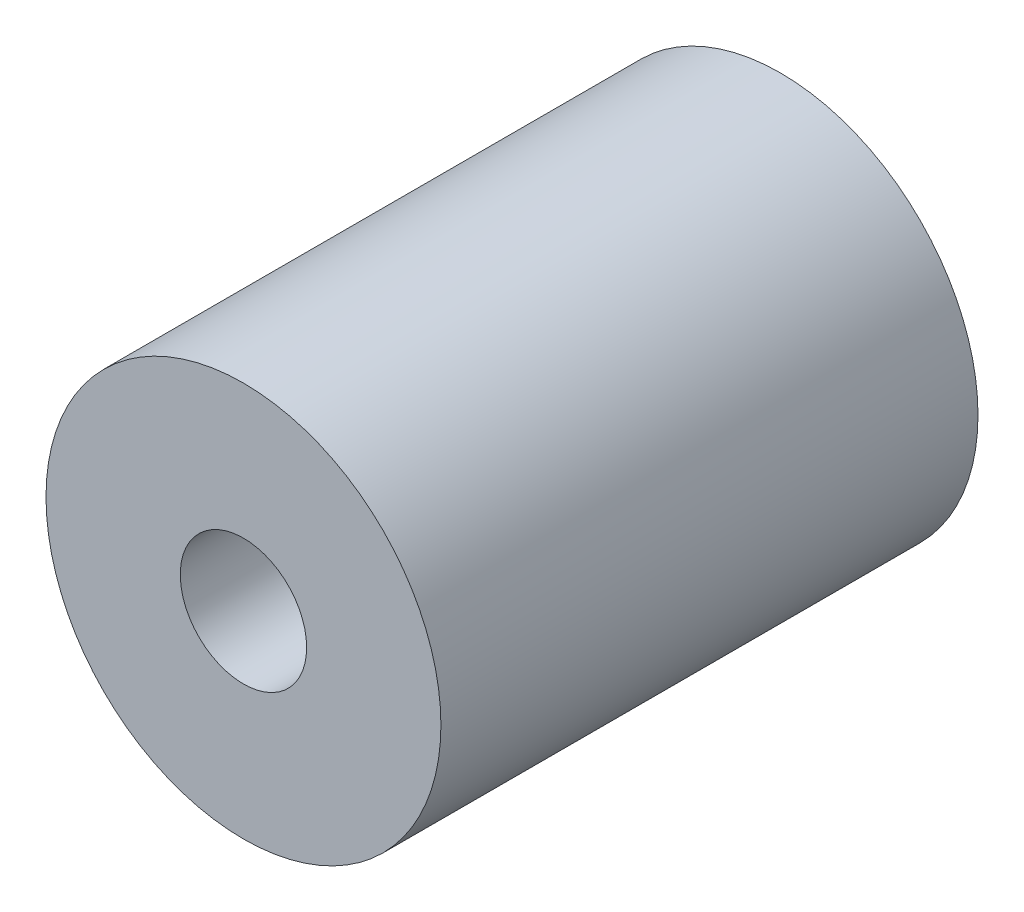
ISO-10303-21;
HEADER;
FILE_DESCRIPTION(('STEP AP214'),'2;1');
FILE_NAME('part.step','',(''),(''),'','','');
FILE_SCHEMA(('AUTOMOTIVE_DESIGN { 1 0 10303 214 1 1 1 1 }'));
ENDSEC;
DATA;
#1=APPLICATION_CONTEXT('core data for automotive mechanical design processes');
#2=APPLICATION_PROTOCOL_DEFINITION('international standard','automotive_design',2000,#1);
#3=PRODUCT_CONTEXT('',#1,'mechanical');
#4=PRODUCT('Part','Part','',(#3));
#5=PRODUCT_RELATED_PRODUCT_CATEGORY('part','',(#4));
#6=PRODUCT_DEFINITION_FORMATION('','',#4);
#7=PRODUCT_DEFINITION_CONTEXT('part definition',#1,'design');
#8=PRODUCT_DEFINITION('design','',#6,#7);
#9=PRODUCT_DEFINITION_SHAPE('','',#8);
#10=(LENGTH_UNIT() NAMED_UNIT(*) SI_UNIT(.MILLI.,.METRE.));
#11=(NAMED_UNIT(*) PLANE_ANGLE_UNIT() SI_UNIT($,.RADIAN.));
#12=(NAMED_UNIT(*) SI_UNIT($,.STERADIAN.) SOLID_ANGLE_UNIT());
#13=UNCERTAINTY_MEASURE_WITH_UNIT(LENGTH_MEASURE(1.E-05),#10,'distance_accuracy_value','');
#14=(GEOMETRIC_REPRESENTATION_CONTEXT(3) GLOBAL_UNCERTAINTY_ASSIGNED_CONTEXT((#13)) GLOBAL_UNIT_ASSIGNED_CONTEXT((#10,
#11,#12)) REPRESENTATION_CONTEXT('',''));
#15=CARTESIAN_POINT('',(0.,0.,0.));
#16=DIRECTION('',(0.,0.,1.));
#17=DIRECTION('',(1.,0.,0.));
#18=AXIS2_PLACEMENT_3D('',#15,#16,#17);
#19=CARTESIAN_POINT('',(0.,0.,34.));
#20=DIRECTION('',(0.,0.,-1.));
#21=DIRECTION('',(-1.,0.,0.));
#22=AXIS2_PLACEMENT_3D('',#19,#20,#21);
#23=CYLINDRICAL_SURFACE('',#22,12.5);
#24=CARTESIAN_POINT('',(0.,0.,34.));
#25=DIRECTION('',(0.,0.,1.));
#26=DIRECTION('',(1.,0.,0.));
#27=AXIS2_PLACEMENT_3D('',#24,#25,#26);
#28=CIRCLE('',#27,12.5);
#29=CARTESIAN_POINT('',(12.5,0.,34.));
#30=VERTEX_POINT('',#29);
#31=EDGE_CURVE('E10',#30,#30,#28,.T.);
#32=ORIENTED_EDGE('',*,*,#31,.F.);
#33=EDGE_LOOP('',(#32));
#34=FACE_BOUND('',#33,.T.);
#35=CARTESIAN_POINT('',(0.,0.,0.));
#36=DIRECTION('',(0.,0.,1.));
#37=DIRECTION('',(1.,0.,0.));
#38=AXIS2_PLACEMENT_3D('',#35,#36,#37);
#39=CIRCLE('',#38,12.5);
#40=CARTESIAN_POINT('',(12.5,0.,0.));
#41=VERTEX_POINT('',#40);
#42=EDGE_CURVE('E34',#41,#41,#39,.T.);
#43=ORIENTED_EDGE('',*,*,#42,.T.);
#44=EDGE_LOOP('',(#43));
#45=FACE_BOUND('',#44,.T.);
#46=ADVANCED_FACE('F31',(#34,#45),#23,.T.);
#47=CARTESIAN_POINT('',(0.,0.,34.));
#48=DIRECTION('',(0.,0.,1.));
#49=DIRECTION('',(1.,0.,0.));
#50=AXIS2_PLACEMENT_3D('',#47,#48,#49);
#51=PLANE('',#50);
#52=CARTESIAN_POINT('',(0.,0.,34.));
#53=DIRECTION('',(0.,0.,1.));
#54=DIRECTION('',(1.,0.,0.));
#55=AXIS2_PLACEMENT_3D('',#52,#53,#54);
#56=CIRCLE('',#55,4.);
#57=CARTESIAN_POINT('',(4.,0.,34.));
#58=VERTEX_POINT('',#57);
#59=EDGE_CURVE('E43',#58,#58,#56,.T.);
#60=ORIENTED_EDGE('',*,*,#59,.F.);
#61=EDGE_LOOP('',(#60));
#62=FACE_BOUND('',#61,.T.);
#63=ORIENTED_EDGE('',*,*,#31,.T.);
#64=EDGE_LOOP('',(#63));
#65=FACE_BOUND('',#64,.T.);
#66=ADVANCED_FACE('F68',(#62,#65),#51,.T.);
#67=CARTESIAN_POINT('',(0.,0.,0.));
#68=DIRECTION('',(0.,0.,1.));
#69=DIRECTION('',(1.,0.,0.));
#70=AXIS2_PLACEMENT_3D('',#67,#68,#69);
#71=PLANE('',#70);
#72=CARTESIAN_POINT('',(0.,0.,0.));
#73=DIRECTION('',(0.,0.,-1.));
#74=DIRECTION('',(-1.,0.,0.));
#75=AXIS2_PLACEMENT_3D('',#72,#73,#74);
#76=CIRCLE('',#75,4.);
#77=CARTESIAN_POINT('',(-4.,0.,0.));
#78=VERTEX_POINT('',#77);
#79=EDGE_CURVE('E49',#78,#78,#76,.T.);
#80=ORIENTED_EDGE('',*,*,#79,.F.);
#81=EDGE_LOOP('',(#80));
#82=FACE_BOUND('',#81,.T.);
#83=ORIENTED_EDGE('',*,*,#42,.F.);
#84=EDGE_LOOP('',(#83));
#85=FACE_BOUND('',#84,.T.);
#86=ADVANCED_FACE('F64',(#82,#85),#71,.F.);
#87=CARTESIAN_POINT('',(0.,0.,22.));
#88=DIRECTION('',(0.,0.,1.));
#89=DIRECTION('',(1.,0.,0.));
#90=AXIS2_PLACEMENT_3D('',#87,#88,#89);
#91=CYLINDRICAL_SURFACE('',#90,4.);
#92=CARTESIAN_POINT('',(0.,0.,22.));
#93=DIRECTION('',(0.,0.,1.));
#94=DIRECTION('',(1.,0.,0.));
#95=AXIS2_PLACEMENT_3D('',#92,#93,#94);
#96=CIRCLE('',#95,4.);
#97=CARTESIAN_POINT('',(4.,0.,22.));
#98=VERTEX_POINT('',#97);
#99=EDGE_CURVE('E41',#98,#98,#96,.T.);
#100=ORIENTED_EDGE('',*,*,#99,.F.);
#101=EDGE_LOOP('',(#100));
#102=FACE_BOUND('',#101,.T.);
#103=ORIENTED_EDGE('',*,*,#59,.T.);
#104=EDGE_LOOP('',(#103));
#105=FACE_BOUND('',#104,.T.);
#106=ADVANCED_FACE('F67',(#102,#105),#91,.F.);
#107=CARTESIAN_POINT('',(0.,0.,22.));
#108=DIRECTION('',(0.,0.,1.));
#109=DIRECTION('',(1.,0.,0.));
#110=AXIS2_PLACEMENT_3D('',#107,#108,#109);
#111=PLANE('',#110);
#112=ORIENTED_EDGE('',*,*,#99,.T.);
#113=EDGE_LOOP('',(#112));
#114=FACE_BOUND('',#113,.T.);
#115=ADVANCED_FACE('F60',(#114),#111,.T.);
#116=CARTESIAN_POINT('',(0.,0.,12.));
#117=DIRECTION('',(0.,0.,-1.));
#118=DIRECTION('',(-1.,0.,0.));
#119=AXIS2_PLACEMENT_3D('',#116,#117,#118);
#120=CYLINDRICAL_SURFACE('',#119,4.);
#121=CARTESIAN_POINT('',(0.,0.,12.));
#122=DIRECTION('',(0.,0.,-1.));
#123=DIRECTION('',(-1.,0.,0.));
#124=AXIS2_PLACEMENT_3D('',#121,#122,#123);
#125=CIRCLE('',#124,4.);
#126=CARTESIAN_POINT('',(-4.,0.,12.));
#127=VERTEX_POINT('',#126);
#128=EDGE_CURVE('E46',#127,#127,#125,.T.);
#129=ORIENTED_EDGE('',*,*,#128,.F.);
#130=EDGE_LOOP('',(#129));
#131=FACE_BOUND('',#130,.T.);
#132=ORIENTED_EDGE('',*,*,#79,.T.);
#133=EDGE_LOOP('',(#132));
#134=FACE_BOUND('',#133,.T.);
#135=ADVANCED_FACE('F57',(#131,#134),#120,.F.);
#136=CARTESIAN_POINT('',(0.,0.,12.));
#137=DIRECTION('',(0.,0.,-1.));
#138=DIRECTION('',(-1.,0.,0.));
#139=AXIS2_PLACEMENT_3D('',#136,#137,#138);
#140=PLANE('',#139);
#141=ORIENTED_EDGE('',*,*,#128,.T.);
#142=EDGE_LOOP('',(#141));
#143=FACE_BOUND('',#142,.T.);
#144=ADVANCED_FACE('F55',(#143),#140,.T.);
#145=CLOSED_SHELL('',(#46,#66,#86,#106,#115,#135,#144));
#146=MANIFOLD_SOLID_BREP('B2',#145);
#147=ADVANCED_BREP_SHAPE_REPRESENTATION('',(#18,#146),#14);
#148=SHAPE_DEFINITION_REPRESENTATION(#9,#147);
ENDSEC;
END-ISO-10303-21;
